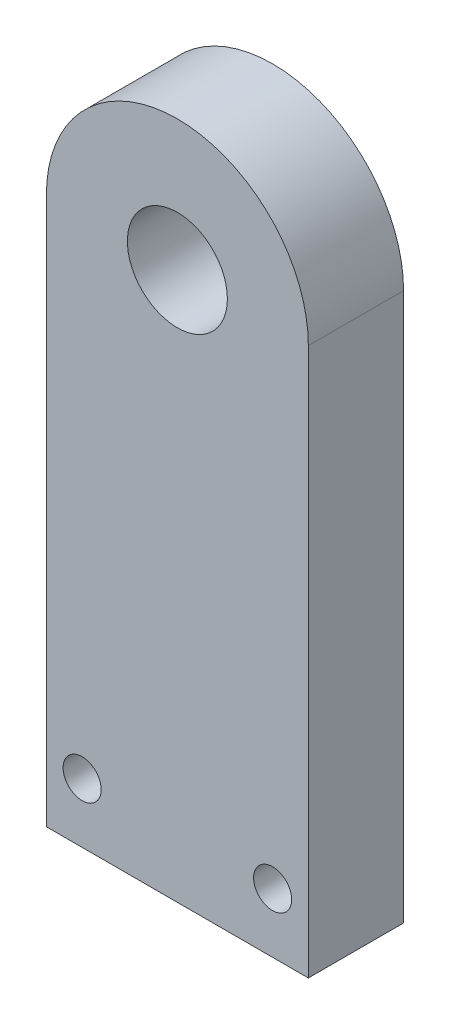
ISO-10303-21;
HEADER;
FILE_DESCRIPTION(('STEP AP214'),'2;1');
FILE_NAME('part.step','',(''),(''),'','','');
FILE_SCHEMA(('AUTOMOTIVE_DESIGN { 1 0 10303 214 1 1 1 1 }'));
ENDSEC;
DATA;
#1=APPLICATION_CONTEXT('core data for automotive mechanical design processes');
#2=APPLICATION_PROTOCOL_DEFINITION('international standard','automotive_design',2000,#1);
#3=PRODUCT_CONTEXT('',#1,'mechanical');
#4=PRODUCT('Part','Part','',(#3));
#5=PRODUCT_RELATED_PRODUCT_CATEGORY('part','',(#4));
#6=PRODUCT_DEFINITION_FORMATION('','',#4);
#7=PRODUCT_DEFINITION_CONTEXT('part definition',#1,'design');
#8=PRODUCT_DEFINITION('design','',#6,#7);
#9=PRODUCT_DEFINITION_SHAPE('','',#8);
#10=(LENGTH_UNIT() NAMED_UNIT(*) SI_UNIT(.MILLI.,.METRE.));
#11=(NAMED_UNIT(*) PLANE_ANGLE_UNIT() SI_UNIT($,.RADIAN.));
#12=(NAMED_UNIT(*) SI_UNIT($,.STERADIAN.) SOLID_ANGLE_UNIT());
#13=UNCERTAINTY_MEASURE_WITH_UNIT(LENGTH_MEASURE(1.E-05),#10,'distance_accuracy_value','');
#14=(GEOMETRIC_REPRESENTATION_CONTEXT(3) GLOBAL_UNCERTAINTY_ASSIGNED_CONTEXT((#13)) GLOBAL_UNIT_ASSIGNED_CONTEXT((#10,
#11,#12)) REPRESENTATION_CONTEXT('',''));
#15=CARTESIAN_POINT('',(0.,0.,0.));
#16=DIRECTION('',(0.,0.,1.));
#17=DIRECTION('',(1.,0.,0.));
#18=AXIS2_PLACEMENT_3D('',#15,#16,#17);
#19=CARTESIAN_POINT('',(0.,0.,4.));
#20=DIRECTION('',(0.,0.,-1.));
#21=DIRECTION('',(-1.,0.,0.));
#22=AXIS2_PLACEMENT_3D('',#19,#20,#21);
#23=CYLINDRICAL_SURFACE('',#22,5.5);
#24=CARTESIAN_POINT('',(0.,0.,0.));
#25=DIRECTION('',(0.,0.,1.));
#26=DIRECTION('',(1.,0.,0.));
#27=AXIS2_PLACEMENT_3D('',#24,#25,#26);
#28=CIRCLE('',#27,5.5);
#29=CARTESIAN_POINT('',(5.5,0.,0.));
#30=VERTEX_POINT('',#29);
#31=CARTESIAN_POINT('',(-5.5,0.,0.));
#32=VERTEX_POINT('',#31);
#33=EDGE_CURVE('E104',#30,#32,#28,.T.);
#34=ORIENTED_EDGE('',*,*,#33,.T.);
#35=DIRECTION('',(0.,0.,-1.));
#36=VECTOR('',#35,1.);
#37=CARTESIAN_POINT('',(-5.5,0.,4.));
#38=LINE('',#37,#36);
#39=CARTESIAN_POINT('',(-5.5,0.,4.));
#40=VERTEX_POINT('',#39);
#41=EDGE_CURVE('E11',#40,#32,#38,.T.);
#42=ORIENTED_EDGE('',*,*,#41,.F.);
#43=CARTESIAN_POINT('',(0.,0.,4.));
#44=DIRECTION('',(0.,0.,1.));
#45=DIRECTION('',(1.,0.,0.));
#46=AXIS2_PLACEMENT_3D('',#43,#44,#45);
#47=CIRCLE('',#46,5.5);
#48=CARTESIAN_POINT('',(5.5,0.,4.));
#49=VERTEX_POINT('',#48);
#50=EDGE_CURVE('E92',#49,#40,#47,.T.);
#51=ORIENTED_EDGE('',*,*,#50,.F.);
#52=DIRECTION('',(0.,0.,-1.));
#53=VECTOR('',#52,1.);
#54=CARTESIAN_POINT('',(5.5,0.,4.));
#55=LINE('',#54,#53);
#56=EDGE_CURVE('E100',#49,#30,#55,.T.);
#57=ORIENTED_EDGE('',*,*,#56,.T.);
#58=EDGE_LOOP('',(#34,#42,#51,#57));
#59=FACE_BOUND('',#58,.T.);
#60=ADVANCED_FACE('F41',(#59),#23,.T.);
#61=CARTESIAN_POINT('',(-5.5,0.,4.));
#62=DIRECTION('',(1.,0.,0.));
#63=DIRECTION('',(0.,1.,0.));
#64=AXIS2_PLACEMENT_3D('',#61,#62,#63);
#65=PLANE('',#64);
#66=DIRECTION('',(0.,-1.,0.));
#67=VECTOR('',#66,1.);
#68=CARTESIAN_POINT('',(-5.5,0.,0.));
#69=LINE('',#68,#67);
#70=CARTESIAN_POINT('',(-5.5,-23.,0.));
#71=VERTEX_POINT('',#70);
#72=EDGE_CURVE('E96',#32,#71,#69,.T.);
#73=ORIENTED_EDGE('',*,*,#72,.T.);
#74=DIRECTION('',(0.,0.,-1.));
#75=VECTOR('',#74,1.);
#76=CARTESIAN_POINT('',(-5.5,-23.,4.));
#77=LINE('',#76,#75);
#78=CARTESIAN_POINT('',(-5.5,-23.,4.));
#79=VERTEX_POINT('',#78);
#80=EDGE_CURVE('E49',#79,#71,#77,.T.);
#81=ORIENTED_EDGE('',*,*,#80,.F.);
#82=DIRECTION('',(0.,-1.,0.));
#83=VECTOR('',#82,1.);
#84=CARTESIAN_POINT('',(-5.5,0.,4.));
#85=LINE('',#84,#83);
#86=EDGE_CURVE('E87',#40,#79,#85,.T.);
#87=ORIENTED_EDGE('',*,*,#86,.F.);
#88=ORIENTED_EDGE('',*,*,#41,.T.);
#89=EDGE_LOOP('',(#73,#81,#87,#88));
#90=FACE_BOUND('',#89,.T.);
#91=ADVANCED_FACE('F95',(#90),#65,.F.);
#92=CARTESIAN_POINT('',(5.5,-23.,4.));
#93=DIRECTION('',(0.,1.,0.));
#94=DIRECTION('',(0.,0.,1.));
#95=AXIS2_PLACEMENT_3D('',#92,#93,#94);
#96=PLANE('',#95);
#97=DIRECTION('',(1.,0.,0.));
#98=VECTOR('',#97,1.);
#99=CARTESIAN_POINT('',(5.5,-23.,0.));
#100=LINE('',#99,#98);
#101=CARTESIAN_POINT('',(5.5,-23.,0.));
#102=VERTEX_POINT('',#101);
#103=EDGE_CURVE('E74',#71,#102,#100,.T.);
#104=ORIENTED_EDGE('',*,*,#103,.T.);
#105=DIRECTION('',(0.,0.,-1.));
#106=VECTOR('',#105,1.);
#107=CARTESIAN_POINT('',(5.5,-23.,4.));
#108=LINE('',#107,#106);
#109=CARTESIAN_POINT('',(5.5,-23.,4.));
#110=VERTEX_POINT('',#109);
#111=EDGE_CURVE('E97',#110,#102,#108,.T.);
#112=ORIENTED_EDGE('',*,*,#111,.F.);
#113=DIRECTION('',(1.,0.,0.));
#114=VECTOR('',#113,1.);
#115=CARTESIAN_POINT('',(5.5,-23.,4.));
#116=LINE('',#115,#114);
#117=EDGE_CURVE('E90',#79,#110,#116,.T.);
#118=ORIENTED_EDGE('',*,*,#117,.F.);
#119=ORIENTED_EDGE('',*,*,#80,.T.);
#120=EDGE_LOOP('',(#104,#112,#118,#119));
#121=FACE_BOUND('',#120,.T.);
#122=ADVANCED_FACE('F98',(#121),#96,.F.);
#123=CARTESIAN_POINT('',(5.5,0.,4.));
#124=DIRECTION('',(-1.,0.,0.));
#125=DIRECTION('',(0.,-1.,0.));
#126=AXIS2_PLACEMENT_3D('',#123,#124,#125);
#127=PLANE('',#126);
#128=DIRECTION('',(0.,1.,0.));
#129=VECTOR('',#128,1.);
#130=CARTESIAN_POINT('',(5.5,0.,0.));
#131=LINE('',#130,#129);
#132=EDGE_CURVE('E80',#102,#30,#131,.T.);
#133=ORIENTED_EDGE('',*,*,#132,.T.);
#134=ORIENTED_EDGE('',*,*,#56,.F.);
#135=DIRECTION('',(0.,1.,0.));
#136=VECTOR('',#135,1.);
#137=CARTESIAN_POINT('',(5.5,0.,4.));
#138=LINE('',#137,#136);
#139=EDGE_CURVE('E57',#110,#49,#138,.T.);
#140=ORIENTED_EDGE('',*,*,#139,.F.);
#141=ORIENTED_EDGE('',*,*,#111,.T.);
#142=EDGE_LOOP('',(#133,#134,#140,#141));
#143=FACE_BOUND('',#142,.T.);
#144=ADVANCED_FACE('F112',(#143),#127,.F.);
#145=CARTESIAN_POINT('',(0.,0.,4.));
#146=DIRECTION('',(0.,0.,1.));
#147=DIRECTION('',(1.,0.,0.));
#148=AXIS2_PLACEMENT_3D('',#145,#146,#147);
#149=PLANE('',#148);
#150=CARTESIAN_POINT('',(0.,0.,4.));
#151=DIRECTION('',(0.,0.,1.));
#152=DIRECTION('',(1.,0.,0.));
#153=AXIS2_PLACEMENT_3D('',#150,#151,#152);
#154=CIRCLE('',#153,2.1);
#155=CARTESIAN_POINT('',(2.1,0.,4.));
#156=VERTEX_POINT('',#155);
#157=EDGE_CURVE('E132',#156,#156,#154,.T.);
#158=ORIENTED_EDGE('',*,*,#157,.F.);
#159=EDGE_LOOP('',(#158));
#160=FACE_BOUND('',#159,.T.);
#161=CARTESIAN_POINT('',(-4.,-20.5,4.));
#162=DIRECTION('',(0.,0.,1.));
#163=DIRECTION('',(1.,0.,0.));
#164=AXIS2_PLACEMENT_3D('',#161,#162,#163);
#165=CIRCLE('',#164,0.799999999999999);
#166=CARTESIAN_POINT('',(-3.2,-20.5,4.));
#167=VERTEX_POINT('',#166);
#168=EDGE_CURVE('E126',#167,#167,#165,.T.);
#169=ORIENTED_EDGE('',*,*,#168,.F.);
#170=EDGE_LOOP('',(#169));
#171=FACE_BOUND('',#170,.T.);
#172=CARTESIAN_POINT('',(4.,-20.5,4.));
#173=DIRECTION('',(0.,0.,1.));
#174=DIRECTION('',(1.,0.,0.));
#175=AXIS2_PLACEMENT_3D('',#172,#173,#174);
#176=CIRCLE('',#175,0.799999999999999);
#177=CARTESIAN_POINT('',(4.8,-20.5,4.));
#178=VERTEX_POINT('',#177);
#179=EDGE_CURVE('E120',#178,#178,#176,.T.);
#180=ORIENTED_EDGE('',*,*,#179,.F.);
#181=EDGE_LOOP('',(#180));
#182=FACE_BOUND('',#181,.T.);
#183=ORIENTED_EDGE('',*,*,#50,.T.);
#184=ORIENTED_EDGE('',*,*,#86,.T.);
#185=ORIENTED_EDGE('',*,*,#117,.T.);
#186=ORIENTED_EDGE('',*,*,#139,.T.);
#187=EDGE_LOOP('',(#183,#184,#185,#186));
#188=FACE_BOUND('',#187,.T.);
#189=ADVANCED_FACE('F88',(#160,#171,#182,#188),#149,.T.);
#190=CARTESIAN_POINT('',(0.,0.,0.));
#191=DIRECTION('',(0.,0.,1.));
#192=DIRECTION('',(1.,0.,0.));
#193=AXIS2_PLACEMENT_3D('',#190,#191,#192);
#194=PLANE('',#193);
#195=CARTESIAN_POINT('',(0.,0.,0.));
#196=DIRECTION('',(0.,0.,1.));
#197=DIRECTION('',(1.,0.,0.));
#198=AXIS2_PLACEMENT_3D('',#195,#196,#197);
#199=CIRCLE('',#198,2.1);
#200=CARTESIAN_POINT('',(2.1,0.,0.));
#201=VERTEX_POINT('',#200);
#202=EDGE_CURVE('E129',#201,#201,#199,.T.);
#203=ORIENTED_EDGE('',*,*,#202,.T.);
#204=EDGE_LOOP('',(#203));
#205=FACE_BOUND('',#204,.T.);
#206=CARTESIAN_POINT('',(-4.,-20.5,0.));
#207=DIRECTION('',(0.,0.,1.));
#208=DIRECTION('',(1.,0.,0.));
#209=AXIS2_PLACEMENT_3D('',#206,#207,#208);
#210=CIRCLE('',#209,0.799999999999999);
#211=CARTESIAN_POINT('',(-3.2,-20.5,0.));
#212=VERTEX_POINT('',#211);
#213=EDGE_CURVE('E123',#212,#212,#210,.T.);
#214=ORIENTED_EDGE('',*,*,#213,.T.);
#215=EDGE_LOOP('',(#214));
#216=FACE_BOUND('',#215,.T.);
#217=CARTESIAN_POINT('',(4.,-20.5,0.));
#218=DIRECTION('',(0.,0.,1.));
#219=DIRECTION('',(1.,0.,0.));
#220=AXIS2_PLACEMENT_3D('',#217,#218,#219);
#221=CIRCLE('',#220,0.799999999999999);
#222=CARTESIAN_POINT('',(4.8,-20.5,0.));
#223=VERTEX_POINT('',#222);
#224=EDGE_CURVE('E107',#223,#223,#221,.T.);
#225=ORIENTED_EDGE('',*,*,#224,.T.);
#226=EDGE_LOOP('',(#225));
#227=FACE_BOUND('',#226,.T.);
#228=ORIENTED_EDGE('',*,*,#33,.F.);
#229=ORIENTED_EDGE('',*,*,#132,.F.);
#230=ORIENTED_EDGE('',*,*,#103,.F.);
#231=ORIENTED_EDGE('',*,*,#72,.F.);
#232=EDGE_LOOP('',(#228,#229,#230,#231));
#233=FACE_BOUND('',#232,.T.);
#234=ADVANCED_FACE('F115',(#205,#216,#227,#233),#194,.F.);
#235=CARTESIAN_POINT('',(4.,-20.5,4.));
#236=DIRECTION('',(0.,0.,1.));
#237=DIRECTION('',(1.,0.,0.));
#238=AXIS2_PLACEMENT_3D('',#235,#236,#237);
#239=CYLINDRICAL_SURFACE('',#238,0.799999999999999);
#240=ORIENTED_EDGE('',*,*,#224,.F.);
#241=EDGE_LOOP('',(#240));
#242=FACE_BOUND('',#241,.T.);
#243=ORIENTED_EDGE('',*,*,#179,.T.);
#244=EDGE_LOOP('',(#243));
#245=FACE_BOUND('',#244,.T.);
#246=ADVANCED_FACE('F145',(#242,#245),#239,.F.);
#247=CARTESIAN_POINT('',(-4.,-20.5,4.));
#248=DIRECTION('',(0.,0.,1.));
#249=DIRECTION('',(1.,0.,0.));
#250=AXIS2_PLACEMENT_3D('',#247,#248,#249);
#251=CYLINDRICAL_SURFACE('',#250,0.799999999999999);
#252=ORIENTED_EDGE('',*,*,#213,.F.);
#253=EDGE_LOOP('',(#252));
#254=FACE_BOUND('',#253,.T.);
#255=ORIENTED_EDGE('',*,*,#168,.T.);
#256=EDGE_LOOP('',(#255));
#257=FACE_BOUND('',#256,.T.);
#258=ADVANCED_FACE('F147',(#254,#257),#251,.F.);
#259=CARTESIAN_POINT('',(0.,0.,4.));
#260=DIRECTION('',(0.,0.,1.));
#261=DIRECTION('',(1.,0.,0.));
#262=AXIS2_PLACEMENT_3D('',#259,#260,#261);
#263=CYLINDRICAL_SURFACE('',#262,2.1);
#264=ORIENTED_EDGE('',*,*,#202,.F.);
#265=EDGE_LOOP('',(#264));
#266=FACE_BOUND('',#265,.T.);
#267=ORIENTED_EDGE('',*,*,#157,.T.);
#268=EDGE_LOOP('',(#267));
#269=FACE_BOUND('',#268,.T.);
#270=ADVANCED_FACE('F136',(#266,#269),#263,.F.);
#271=CLOSED_SHELL('',(#60,#91,#122,#144,#189,#234,#246,#258,#270));
#272=MANIFOLD_SOLID_BREP('B2',#271);
#273=ADVANCED_BREP_SHAPE_REPRESENTATION('',(#18,#272),#14);
#274=SHAPE_DEFINITION_REPRESENTATION(#9,#273);
ENDSEC;
END-ISO-10303-21;
